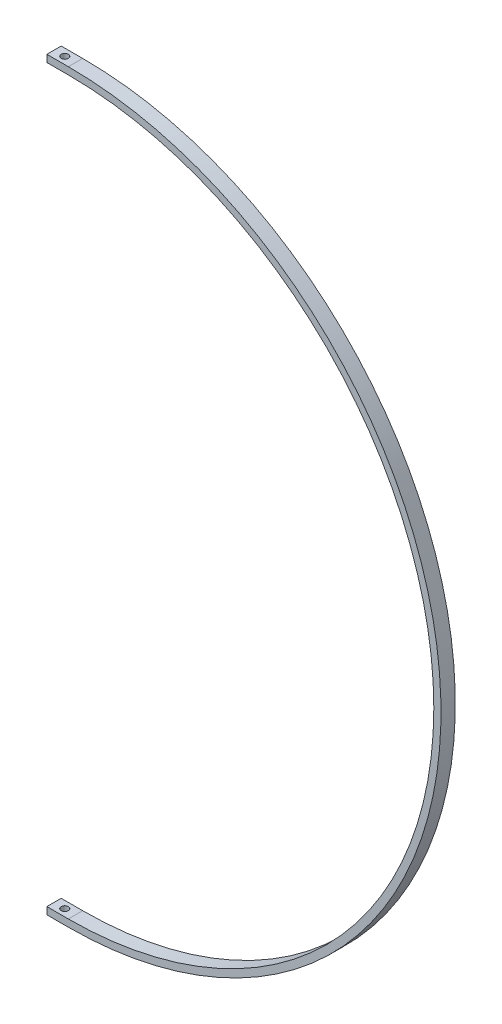
ISO-10303-21;
HEADER;
FILE_DESCRIPTION(('STEP AP214'),'2;1');
FILE_NAME('part.step','',(''),(''),'','','');
FILE_SCHEMA(('AUTOMOTIVE_DESIGN { 1 0 10303 214 1 1 1 1 }'));
ENDSEC;
DATA;
#1=APPLICATION_CONTEXT('core data for automotive mechanical design processes');
#2=APPLICATION_PROTOCOL_DEFINITION('international standard','automotive_design',2000,#1);
#3=PRODUCT_CONTEXT('',#1,'mechanical');
#4=PRODUCT('Part','Part','',(#3));
#5=PRODUCT_RELATED_PRODUCT_CATEGORY('part','',(#4));
#6=PRODUCT_DEFINITION_FORMATION('','',#4);
#7=PRODUCT_DEFINITION_CONTEXT('part definition',#1,'design');
#8=PRODUCT_DEFINITION('design','',#6,#7);
#9=PRODUCT_DEFINITION_SHAPE('','',#8);
#10=(LENGTH_UNIT() NAMED_UNIT(*) SI_UNIT(.MILLI.,.METRE.));
#11=(NAMED_UNIT(*) PLANE_ANGLE_UNIT() SI_UNIT($,.RADIAN.));
#12=(NAMED_UNIT(*) SI_UNIT($,.STERADIAN.) SOLID_ANGLE_UNIT());
#13=UNCERTAINTY_MEASURE_WITH_UNIT(LENGTH_MEASURE(1.E-05),#10,'distance_accuracy_value','');
#14=(GEOMETRIC_REPRESENTATION_CONTEXT(3) GLOBAL_UNCERTAINTY_ASSIGNED_CONTEXT((#13)) GLOBAL_UNIT_ASSIGNED_CONTEXT((#10,
#11,#12)) REPRESENTATION_CONTEXT('',''));
#15=CARTESIAN_POINT('',(0.,0.,0.));
#16=DIRECTION('',(0.,0.,1.));
#17=DIRECTION('',(1.,0.,0.));
#18=AXIS2_PLACEMENT_3D('',#15,#16,#17);
#19=CARTESIAN_POINT('',(-19.05,323.85,6.35000000000169));
#20=DIRECTION('',(0.,-1.,0.));
#21=DIRECTION('',(0.,0.,-1.));
#22=AXIS2_PLACEMENT_3D('',#19,#20,#21);
#23=PLANE('',#22);
#24=CARTESIAN_POINT('',(-9.525,323.85,0.));
#25=DIRECTION('',(0.,-1.,0.));
#26=DIRECTION('',(0.,0.,-1.));
#27=AXIS2_PLACEMENT_3D('',#24,#25,#26);
#28=CIRCLE('',#27,3.175);
#29=CARTESIAN_POINT('',(-9.525,323.85,3.175));
#30=VERTEX_POINT('',#29);
#31=EDGE_CURVE('E158',#30,#30,#28,.T.);
#32=ORIENTED_EDGE('',*,*,#31,.F.);
#33=EDGE_LOOP('',(#32));
#34=FACE_BOUND('',#33,.T.);
#35=DIRECTION('',(0.,0.,-1.));
#36=VECTOR('',#35,1.);
#37=CARTESIAN_POINT('',(0.,323.85,6.35000000000169));
#38=LINE('',#37,#36);
#39=CARTESIAN_POINT('',(0.,323.85,6.35000000000169));
#40=VERTEX_POINT('',#39);
#41=CARTESIAN_POINT('',(0.,323.85,-6.34999999999831));
#42=VERTEX_POINT('',#41);
#43=EDGE_CURVE('E161',#40,#42,#38,.T.);
#44=ORIENTED_EDGE('',*,*,#43,.F.);
#45=DIRECTION('',(1.,0.,0.));
#46=VECTOR('',#45,1.);
#47=CARTESIAN_POINT('',(-19.05,323.85,6.35000000000169));
#48=LINE('',#47,#46);
#49=CARTESIAN_POINT('',(-19.05,323.85,6.35000000000169));
#50=VERTEX_POINT('',#49);
#51=EDGE_CURVE('E11',#50,#40,#48,.T.);
#52=ORIENTED_EDGE('',*,*,#51,.F.);
#53=DIRECTION('',(0.,0.,-1.));
#54=VECTOR('',#53,1.);
#55=CARTESIAN_POINT('',(-19.05,323.85,6.35000000000169));
#56=LINE('',#55,#54);
#57=CARTESIAN_POINT('',(-19.05,323.85,-6.34999999999831));
#58=VERTEX_POINT('',#57);
#59=EDGE_CURVE('E162',#50,#58,#56,.T.);
#60=ORIENTED_EDGE('',*,*,#59,.T.);
#61=DIRECTION('',(1.,0.,0.));
#62=VECTOR('',#61,1.);
#63=CARTESIAN_POINT('',(-19.05,323.85,-6.34999999999831));
#64=LINE('',#63,#62);
#65=EDGE_CURVE('E37',#58,#42,#64,.T.);
#66=ORIENTED_EDGE('',*,*,#65,.T.);
#67=EDGE_LOOP('',(#44,#52,#60,#66));
#68=FACE_BOUND('',#67,.T.);
#69=ADVANCED_FACE('F34',(#34,#68),#23,.T.);
#70=CARTESIAN_POINT('',(-19.05,330.2,6.35000000000169));
#71=DIRECTION('',(0.,0.,1.));
#72=DIRECTION('',(1.,0.,0.));
#73=AXIS2_PLACEMENT_3D('',#70,#71,#72);
#74=PLANE('',#73);
#75=ORIENTED_EDGE('',*,*,#51,.T.);
#76=CARTESIAN_POINT('',(0.,0.,6.35000000000169));
#77=DIRECTION('',(0.,0.,1.));
#78=DIRECTION('',(1.,0.,0.));
#79=AXIS2_PLACEMENT_3D('',#76,#77,#78);
#80=CIRCLE('',#79,323.85);
#81=CARTESIAN_POINT('',(0.,-323.85,6.35000000000169));
#82=VERTEX_POINT('',#81);
#83=EDGE_CURVE('E106',#82,#40,#80,.T.);
#84=ORIENTED_EDGE('',*,*,#83,.F.);
#85=DIRECTION('',(1.,0.,0.));
#86=VECTOR('',#85,1.);
#87=CARTESIAN_POINT('',(-19.05,-323.85,6.35000000000169));
#88=LINE('',#87,#86);
#89=CARTESIAN_POINT('',(-19.05,-323.85,6.35000000000169));
#90=VERTEX_POINT('',#89);
#91=EDGE_CURVE('E110',#90,#82,#88,.T.);
#92=ORIENTED_EDGE('',*,*,#91,.F.);
#93=DIRECTION('',(0.,1.,0.));
#94=VECTOR('',#93,1.);
#95=CARTESIAN_POINT('',(-19.05,-330.2,6.35000000000169));
#96=LINE('',#95,#94);
#97=CARTESIAN_POINT('',(-19.05,-330.2,6.35000000000169));
#98=VERTEX_POINT('',#97);
#99=EDGE_CURVE('E139',#98,#90,#96,.T.);
#100=ORIENTED_EDGE('',*,*,#99,.F.);
#101=DIRECTION('',(1.,0.,0.));
#102=VECTOR('',#101,1.);
#103=CARTESIAN_POINT('',(-19.05,-330.2,6.35000000000169));
#104=LINE('',#103,#102);
#105=CARTESIAN_POINT('',(0.,-330.2,6.35000000000169));
#106=VERTEX_POINT('',#105);
#107=EDGE_CURVE('E125',#98,#106,#104,.T.);
#108=ORIENTED_EDGE('',*,*,#107,.T.);
#109=CARTESIAN_POINT('',(0.,0.,6.35000000000169));
#110=DIRECTION('',(0.,0.,1.));
#111=DIRECTION('',(1.,0.,0.));
#112=AXIS2_PLACEMENT_3D('',#109,#110,#111);
#113=CIRCLE('',#112,330.2);
#114=CARTESIAN_POINT('',(0.,330.2,6.35000000000169));
#115=VERTEX_POINT('',#114);
#116=EDGE_CURVE('E153',#106,#115,#113,.T.);
#117=ORIENTED_EDGE('',*,*,#116,.T.);
#118=DIRECTION('',(1.,0.,0.));
#119=VECTOR('',#118,1.);
#120=CARTESIAN_POINT('',(-19.05,330.2,6.35000000000169));
#121=LINE('',#120,#119);
#122=CARTESIAN_POINT('',(-19.05,330.2,6.35000000000169));
#123=VERTEX_POINT('',#122);
#124=EDGE_CURVE('E43',#123,#115,#121,.T.);
#125=ORIENTED_EDGE('',*,*,#124,.F.);
#126=DIRECTION('',(0.,-1.,0.));
#127=VECTOR('',#126,1.);
#128=CARTESIAN_POINT('',(-19.05,330.2,6.35000000000169));
#129=LINE('',#128,#127);
#130=EDGE_CURVE('E167',#123,#50,#129,.T.);
#131=ORIENTED_EDGE('',*,*,#130,.T.);
#132=EDGE_LOOP('',(#75,#84,#92,#100,#108,#117,#125,#131));
#133=FACE_BOUND('',#132,.T.);
#134=ADVANCED_FACE('F108',(#133),#74,.T.);
#135=CARTESIAN_POINT('',(-19.05,330.2,6.35000000000169));
#136=DIRECTION('',(0.,-1.,0.));
#137=DIRECTION('',(0.,0.,-1.));
#138=AXIS2_PLACEMENT_3D('',#135,#136,#137);
#139=PLANE('',#138);
#140=CARTESIAN_POINT('',(-9.525,330.2,0.));
#141=DIRECTION('',(0.,1.,0.));
#142=DIRECTION('',(0.,0.,1.));
#143=AXIS2_PLACEMENT_3D('',#140,#141,#142);
#144=CIRCLE('',#143,3.175);
#145=CARTESIAN_POINT('',(-9.525,330.2,3.175));
#146=VERTEX_POINT('',#145);
#147=EDGE_CURVE('E155',#146,#146,#144,.T.);
#148=ORIENTED_EDGE('',*,*,#147,.F.);
#149=EDGE_LOOP('',(#148));
#150=FACE_BOUND('',#149,.T.);
#151=DIRECTION('',(0.,0.,-1.));
#152=VECTOR('',#151,1.);
#153=CARTESIAN_POINT('',(0.,330.2,6.35000000000169));
#154=LINE('',#153,#152);
#155=CARTESIAN_POINT('',(0.,330.2,-6.34999999999831));
#156=VERTEX_POINT('',#155);
#157=EDGE_CURVE('E66',#115,#156,#154,.T.);
#158=ORIENTED_EDGE('',*,*,#157,.T.);
#159=DIRECTION('',(1.,0.,0.));
#160=VECTOR('',#159,1.);
#161=CARTESIAN_POINT('',(-19.05,330.2,-6.34999999999831));
#162=LINE('',#161,#160);
#163=CARTESIAN_POINT('',(-19.05,330.2,-6.34999999999831));
#164=VERTEX_POINT('',#163);
#165=EDGE_CURVE('E171',#164,#156,#162,.T.);
#166=ORIENTED_EDGE('',*,*,#165,.F.);
#167=DIRECTION('',(0.,0.,-1.));
#168=VECTOR('',#167,1.);
#169=CARTESIAN_POINT('',(-19.05,330.2,6.35000000000169));
#170=LINE('',#169,#168);
#171=EDGE_CURVE('E165',#123,#164,#170,.T.);
#172=ORIENTED_EDGE('',*,*,#171,.F.);
#173=ORIENTED_EDGE('',*,*,#124,.T.);
#174=EDGE_LOOP('',(#158,#166,#172,#173));
#175=FACE_BOUND('',#174,.T.);
#176=ADVANCED_FACE('F205',(#150,#175),#139,.F.);
#177=CARTESIAN_POINT('',(-19.05,330.2,-6.34999999999831));
#178=DIRECTION('',(0.,0.,1.));
#179=DIRECTION('',(1.,0.,0.));
#180=AXIS2_PLACEMENT_3D('',#177,#178,#179);
#181=PLANE('',#180);
#182=ORIENTED_EDGE('',*,*,#165,.T.);
#183=CARTESIAN_POINT('',(0.,0.,-6.3499999999983));
#184=DIRECTION('',(0.,0.,1.));
#185=DIRECTION('',(1.,0.,0.));
#186=AXIS2_PLACEMENT_3D('',#183,#184,#185);
#187=CIRCLE('',#186,330.2);
#188=CARTESIAN_POINT('',(0.,-330.2,-6.34999999999831));
#189=VERTEX_POINT('',#188);
#190=EDGE_CURVE('E150',#189,#156,#187,.T.);
#191=ORIENTED_EDGE('',*,*,#190,.F.);
#192=DIRECTION('',(1.,0.,0.));
#193=VECTOR('',#192,1.);
#194=CARTESIAN_POINT('',(-19.05,-330.2,-6.34999999999831));
#195=LINE('',#194,#193);
#196=CARTESIAN_POINT('',(-19.05,-330.2,-6.34999999999831));
#197=VERTEX_POINT('',#196);
#198=EDGE_CURVE('E144',#197,#189,#195,.T.);
#199=ORIENTED_EDGE('',*,*,#198,.F.);
#200=DIRECTION('',(0.,1.,0.));
#201=VECTOR('',#200,1.);
#202=CARTESIAN_POINT('',(-19.05,-330.2,-6.34999999999831));
#203=LINE('',#202,#201);
#204=CARTESIAN_POINT('',(-19.05,-323.85,-6.34999999999831));
#205=VERTEX_POINT('',#204);
#206=EDGE_CURVE('E175',#197,#205,#203,.T.);
#207=ORIENTED_EDGE('',*,*,#206,.T.);
#208=DIRECTION('',(1.,0.,0.));
#209=VECTOR('',#208,1.);
#210=CARTESIAN_POINT('',(-19.05,-323.85,-6.34999999999831));
#211=LINE('',#210,#209);
#212=CARTESIAN_POINT('',(0.,-323.85,-6.34999999999831));
#213=VERTEX_POINT('',#212);
#214=EDGE_CURVE('E147',#205,#213,#211,.T.);
#215=ORIENTED_EDGE('',*,*,#214,.T.);
#216=CARTESIAN_POINT('',(0.,0.,-6.3499999999983));
#217=DIRECTION('',(0.,0.,1.));
#218=DIRECTION('',(1.,0.,0.));
#219=AXIS2_PLACEMENT_3D('',#216,#217,#218);
#220=CIRCLE('',#219,323.85);
#221=EDGE_CURVE('E116',#213,#42,#220,.T.);
#222=ORIENTED_EDGE('',*,*,#221,.T.);
#223=ORIENTED_EDGE('',*,*,#65,.F.);
#224=DIRECTION('',(0.,-1.,0.));
#225=VECTOR('',#224,1.);
#226=CARTESIAN_POINT('',(-19.05,330.2,-6.34999999999831));
#227=LINE('',#226,#225);
#228=EDGE_CURVE('E76',#164,#58,#227,.T.);
#229=ORIENTED_EDGE('',*,*,#228,.F.);
#230=EDGE_LOOP('',(#182,#191,#199,#207,#215,#222,#223,#229));
#231=FACE_BOUND('',#230,.T.);
#232=ADVANCED_FACE('F173',(#231),#181,.F.);
#233=CARTESIAN_POINT('',(-19.05,0.,0.));
#234=DIRECTION('',(-1.,0.,0.));
#235=DIRECTION('',(0.,0.,1.));
#236=AXIS2_PLACEMENT_3D('',#233,#234,#235);
#237=PLANE('',#236);
#238=ORIENTED_EDGE('',*,*,#59,.F.);
#239=ORIENTED_EDGE('',*,*,#130,.F.);
#240=ORIENTED_EDGE('',*,*,#171,.T.);
#241=ORIENTED_EDGE('',*,*,#228,.T.);
#242=EDGE_LOOP('',(#238,#239,#240,#241));
#243=FACE_BOUND('',#242,.T.);
#244=ADVANCED_FACE('F197',(#243),#237,.T.);
#245=CARTESIAN_POINT('',(-9.525,311.15,0.));
#246=DIRECTION('',(0.,1.,0.));
#247=DIRECTION('',(0.,0.,1.));
#248=AXIS2_PLACEMENT_3D('',#245,#246,#247);
#249=CYLINDRICAL_SURFACE('',#248,3.175);
#250=CARTESIAN_POINT('',(-9.525,323.85,3.175));
#251=CARTESIAN_POINT('',(-9.525,323.916145833333,3.175));
#252=CARTESIAN_POINT('',(-9.525,323.982291666667,3.175));
#253=CARTESIAN_POINT('',(-9.525,324.114583333333,3.175));
#254=CARTESIAN_POINT('',(-9.525,324.180729166667,3.175));
#255=CARTESIAN_POINT('',(-9.525,324.313020833333,3.175));
#256=CARTESIAN_POINT('',(-9.525,324.379166666667,3.175));
#257=CARTESIAN_POINT('',(-9.525,324.511458333333,3.175));
#258=CARTESIAN_POINT('',(-9.525,324.577604166667,3.175));
#259=CARTESIAN_POINT('',(-9.525,324.709895833333,3.175));
#260=CARTESIAN_POINT('',(-9.525,324.776041666667,3.175));
#261=CARTESIAN_POINT('',(-9.525,324.908333333333,3.175));
#262=CARTESIAN_POINT('',(-9.525,324.974479166667,3.175));
#263=CARTESIAN_POINT('',(-9.525,325.106770833333,3.175));
#264=CARTESIAN_POINT('',(-9.525,325.172916666667,3.175));
#265=CARTESIAN_POINT('',(-9.525,325.305208333333,3.175));
#266=CARTESIAN_POINT('',(-9.525,325.371354166667,3.175));
#267=CARTESIAN_POINT('',(-9.525,325.503645833333,3.175));
#268=CARTESIAN_POINT('',(-9.525,325.569791666667,3.175));
#269=CARTESIAN_POINT('',(-9.525,325.702083333333,3.175));
#270=CARTESIAN_POINT('',(-9.525,325.768229166667,3.175));
#271=CARTESIAN_POINT('',(-9.525,325.900520833333,3.175));
#272=CARTESIAN_POINT('',(-9.525,325.966666666667,3.175));
#273=CARTESIAN_POINT('',(-9.525,326.098958333333,3.175));
#274=CARTESIAN_POINT('',(-9.525,326.165104166667,3.175));
#275=CARTESIAN_POINT('',(-9.525,326.297395833333,3.175));
#276=CARTESIAN_POINT('',(-9.525,326.363541666667,3.175));
#277=CARTESIAN_POINT('',(-9.525,326.495833333333,3.175));
#278=CARTESIAN_POINT('',(-9.525,326.561979166667,3.175));
#279=CARTESIAN_POINT('',(-9.525,326.694270833333,3.175));
#280=CARTESIAN_POINT('',(-9.525,326.760416666667,3.175));
#281=CARTESIAN_POINT('',(-9.525,326.892708333333,3.175));
#282=CARTESIAN_POINT('',(-9.525,326.958854166667,3.175));
#283=CARTESIAN_POINT('',(-9.525,327.091145833333,3.175));
#284=CARTESIAN_POINT('',(-9.525,327.157291666667,3.175));
#285=CARTESIAN_POINT('',(-9.525,327.289583333333,3.175));
#286=CARTESIAN_POINT('',(-9.525,327.355729166667,3.175));
#287=CARTESIAN_POINT('',(-9.525,327.488020833333,3.175));
#288=CARTESIAN_POINT('',(-9.525,327.554166666667,3.175));
#289=CARTESIAN_POINT('',(-9.525,327.686458333333,3.175));
#290=CARTESIAN_POINT('',(-9.525,327.752604166667,3.175));
#291=CARTESIAN_POINT('',(-9.525,327.884895833333,3.175));
#292=CARTESIAN_POINT('',(-9.525,327.951041666667,3.175));
#293=CARTESIAN_POINT('',(-9.525,328.083333333333,3.175));
#294=CARTESIAN_POINT('',(-9.525,328.149479166667,3.175));
#295=CARTESIAN_POINT('',(-9.525,328.281770833333,3.175));
#296=CARTESIAN_POINT('',(-9.525,328.347916666667,3.175));
#297=CARTESIAN_POINT('',(-9.525,328.480208333333,3.175));
#298=CARTESIAN_POINT('',(-9.525,328.546354166667,3.175));
#299=CARTESIAN_POINT('',(-9.525,328.678645833333,3.175));
#300=CARTESIAN_POINT('',(-9.525,328.744791666667,3.175));
#301=CARTESIAN_POINT('',(-9.525,328.877083333333,3.175));
#302=CARTESIAN_POINT('',(-9.525,328.943229166667,3.175));
#303=CARTESIAN_POINT('',(-9.525,329.075520833333,3.175));
#304=CARTESIAN_POINT('',(-9.525,329.141666666667,3.175));
#305=CARTESIAN_POINT('',(-9.525,329.273958333333,3.175));
#306=CARTESIAN_POINT('',(-9.525,329.340104166667,3.175));
#307=CARTESIAN_POINT('',(-9.525,329.472395833333,3.175));
#308=CARTESIAN_POINT('',(-9.525,329.538541666667,3.175));
#309=CARTESIAN_POINT('',(-9.525,329.670833333333,3.175));
#310=CARTESIAN_POINT('',(-9.525,329.736979166667,3.175));
#311=CARTESIAN_POINT('',(-9.525,329.869270833333,3.175));
#312=CARTESIAN_POINT('',(-9.525,329.935416666667,3.175));
#313=CARTESIAN_POINT('',(-9.525,330.067708333333,3.175));
#314=CARTESIAN_POINT('',(-9.525,330.133854166667,3.175));
#315=CARTESIAN_POINT('',(-9.525,330.2,3.175));
#316=B_SPLINE_CURVE_WITH_KNOTS('',3,(#250,#251,#252,#253,#254,#255,#256,#257,#258,#259,#260,
#261,#262,#263,#264,#265,#266,#267,#268,#269,#270,#271,#272,#273,#274,#275,#276,#277,#278,#279,
#280,#281,#282,#283,#284,#285,#286,#287,#288,#289,#290,#291,#292,#293,#294,#295,#296,#297,#298,
#299,#300,#301,#302,#303,#304,#305,#306,#307,#308,#309,#310,#311,#312,#313,#314,#315),
.UNSPECIFIED.,.F.,.F.,(4,2,2,2,2,2,2,2,2,2,2,2,2,2,2,2,2,2,2,2,2,2,2,2,2,2,2,2,2,2,2,2,4),(0.,
0.198437500000037,0.396875000000019,0.5953125,0.793750000000037,0.992187500000019,1.190625,
1.38906250000004,1.58750000000002,1.7859375,1.98437500000004,2.18281250000002,2.38125,
2.57968750000004,2.77812500000002,2.9765625,3.17499999999998,3.37343750000002,3.571875,
3.77031249999998,3.96875000000002,4.1671875,4.36562499999998,4.56406250000002,4.7625,
4.96093749999998,5.15937500000002,5.3578125,5.55624999999998,5.75468750000002,5.953125,
6.15156249999998,6.34999999999997),.UNSPECIFIED.);
#317=EDGE_CURVE('BSEAM190',#30,#146,#316,.T.);
#318=ORIENTED_EDGE('',*,*,#31,.T.);
#319=ORIENTED_EDGE('',*,*,#147,.T.);
#320=ORIENTED_EDGE('',*,*,#317,.T.);
#321=ORIENTED_EDGE('',*,*,#317,.F.);
#322=EDGE_LOOP('',(#318,#320,#319,#321));
#323=FACE_BOUND('',#322,.T.);
#324=ADVANCED_FACE('F190',(#323),#249,.F.);
#325=CARTESIAN_POINT('',(0.,0.,-195.314118549859));
#326=DIRECTION('',(0.,0.,1.));
#327=DIRECTION('',(1.,0.,0.));
#328=AXIS2_PLACEMENT_3D('',#325,#326,#327);
#329=CYLINDRICAL_SURFACE('',#328,330.2);
#330=ORIENTED_EDGE('',*,*,#190,.T.);
#331=ORIENTED_EDGE('',*,*,#157,.F.);
#332=ORIENTED_EDGE('',*,*,#116,.F.);
#333=DIRECTION('',(0.,0.,-1.));
#334=VECTOR('',#333,1.);
#335=CARTESIAN_POINT('',(0.,-330.2,6.35000000000169));
#336=LINE('',#335,#334);
#337=EDGE_CURVE('E130',#106,#189,#336,.T.);
#338=ORIENTED_EDGE('',*,*,#337,.T.);
#339=EDGE_LOOP('',(#330,#331,#332,#338));
#340=FACE_BOUND('',#339,.T.);
#341=ADVANCED_FACE('F188',(#340),#329,.T.);
#342=CARTESIAN_POINT('',(0.,0.,-195.314118549859));
#343=DIRECTION('',(0.,0.,1.));
#344=DIRECTION('',(1.,0.,0.));
#345=AXIS2_PLACEMENT_3D('',#342,#343,#344);
#346=CYLINDRICAL_SURFACE('',#345,323.85);
#347=ORIENTED_EDGE('',*,*,#221,.F.);
#348=DIRECTION('',(0.,0.,-1.));
#349=VECTOR('',#348,1.);
#350=CARTESIAN_POINT('',(0.,-323.85,6.35000000000169));
#351=LINE('',#350,#349);
#352=EDGE_CURVE('E122',#82,#213,#351,.T.);
#353=ORIENTED_EDGE('',*,*,#352,.F.);
#354=ORIENTED_EDGE('',*,*,#83,.T.);
#355=ORIENTED_EDGE('',*,*,#43,.T.);
#356=EDGE_LOOP('',(#347,#353,#354,#355));
#357=FACE_BOUND('',#356,.T.);
#358=ADVANCED_FACE('F127',(#357),#346,.F.);
#359=CARTESIAN_POINT('',(-19.05,-323.85,6.35000000000169));
#360=DIRECTION('',(0.,1.,0.));
#361=DIRECTION('',(0.,0.,-1.));
#362=AXIS2_PLACEMENT_3D('',#359,#360,#361);
#363=PLANE('',#362);
#364=CARTESIAN_POINT('',(-9.525,-323.85,0.));
#365=DIRECTION('',(0.,-1.,0.));
#366=DIRECTION('',(0.,0.,-1.));
#367=AXIS2_PLACEMENT_3D('',#364,#365,#366);
#368=CIRCLE('',#367,3.175);
#369=CARTESIAN_POINT('',(-9.525,-323.85,3.175));
#370=VERTEX_POINT('',#369);
#371=EDGE_CURVE('E131',#370,#370,#368,.T.);
#372=ORIENTED_EDGE('',*,*,#371,.T.);
#373=EDGE_LOOP('',(#372));
#374=FACE_BOUND('',#373,.T.);
#375=ORIENTED_EDGE('',*,*,#352,.T.);
#376=ORIENTED_EDGE('',*,*,#214,.F.);
#377=DIRECTION('',(0.,0.,-1.));
#378=VECTOR('',#377,1.);
#379=CARTESIAN_POINT('',(-19.05,-323.85,6.35000000000169));
#380=LINE('',#379,#378);
#381=EDGE_CURVE('E124',#90,#205,#380,.T.);
#382=ORIENTED_EDGE('',*,*,#381,.F.);
#383=ORIENTED_EDGE('',*,*,#91,.T.);
#384=EDGE_LOOP('',(#375,#376,#382,#383));
#385=FACE_BOUND('',#384,.T.);
#386=ADVANCED_FACE('F120',(#374,#385),#363,.T.);
#387=CARTESIAN_POINT('',(-19.05,-330.2,6.35000000000169));
#388=DIRECTION('',(0.,1.,0.));
#389=DIRECTION('',(0.,0.,-1.));
#390=AXIS2_PLACEMENT_3D('',#387,#388,#389);
#391=PLANE('',#390);
#392=CARTESIAN_POINT('',(-9.525,-330.2,0.));
#393=DIRECTION('',(0.,1.,0.));
#394=DIRECTION('',(0.,0.,1.));
#395=AXIS2_PLACEMENT_3D('',#392,#393,#394);
#396=CIRCLE('',#395,3.175);
#397=CARTESIAN_POINT('',(-9.525,-330.2,3.175));
#398=VERTEX_POINT('',#397);
#399=EDGE_CURVE('E136',#398,#398,#396,.T.);
#400=ORIENTED_EDGE('',*,*,#399,.T.);
#401=EDGE_LOOP('',(#400));
#402=FACE_BOUND('',#401,.T.);
#403=ORIENTED_EDGE('',*,*,#337,.F.);
#404=ORIENTED_EDGE('',*,*,#107,.F.);
#405=DIRECTION('',(0.,0.,-1.));
#406=VECTOR('',#405,1.);
#407=CARTESIAN_POINT('',(-19.05,-330.2,6.35000000000169));
#408=LINE('',#407,#406);
#409=EDGE_CURVE('E178',#98,#197,#408,.T.);
#410=ORIENTED_EDGE('',*,*,#409,.T.);
#411=ORIENTED_EDGE('',*,*,#198,.T.);
#412=EDGE_LOOP('',(#403,#404,#410,#411));
#413=FACE_BOUND('',#412,.T.);
#414=ADVANCED_FACE('F186',(#402,#413),#391,.F.);
#415=CARTESIAN_POINT('',(-19.05,0.,0.));
#416=DIRECTION('',(-1.,0.,0.));
#417=DIRECTION('',(0.,0.,1.));
#418=AXIS2_PLACEMENT_3D('',#415,#416,#417);
#419=PLANE('',#418);
#420=ORIENTED_EDGE('',*,*,#381,.T.);
#421=ORIENTED_EDGE('',*,*,#206,.F.);
#422=ORIENTED_EDGE('',*,*,#409,.F.);
#423=ORIENTED_EDGE('',*,*,#99,.T.);
#424=EDGE_LOOP('',(#420,#421,#422,#423));
#425=FACE_BOUND('',#424,.T.);
#426=ADVANCED_FACE('F180',(#425),#419,.T.);
#427=CARTESIAN_POINT('',(-9.525,-311.15,0.));
#428=DIRECTION('',(0.,-1.,0.));
#429=DIRECTION('',(0.,0.,1.));
#430=AXIS2_PLACEMENT_3D('',#427,#428,#429);
#431=CYLINDRICAL_SURFACE('',#430,3.175);
#432=CARTESIAN_POINT('',(-9.525,-323.85,3.175));
#433=CARTESIAN_POINT('',(-9.525,-323.916145833333,3.175));
#434=CARTESIAN_POINT('',(-9.525,-323.982291666667,3.175));
#435=CARTESIAN_POINT('',(-9.525,-324.114583333333,3.175));
#436=CARTESIAN_POINT('',(-9.525,-324.180729166667,3.175));
#437=CARTESIAN_POINT('',(-9.525,-324.313020833333,3.175));
#438=CARTESIAN_POINT('',(-9.525,-324.379166666667,3.175));
#439=CARTESIAN_POINT('',(-9.525,-324.511458333333,3.175));
#440=CARTESIAN_POINT('',(-9.525,-324.577604166667,3.175));
#441=CARTESIAN_POINT('',(-9.525,-324.709895833333,3.175));
#442=CARTESIAN_POINT('',(-9.525,-324.776041666667,3.175));
#443=CARTESIAN_POINT('',(-9.525,-324.908333333333,3.175));
#444=CARTESIAN_POINT('',(-9.525,-324.974479166667,3.175));
#445=CARTESIAN_POINT('',(-9.525,-325.106770833333,3.175));
#446=CARTESIAN_POINT('',(-9.525,-325.172916666667,3.175));
#447=CARTESIAN_POINT('',(-9.525,-325.305208333333,3.175));
#448=CARTESIAN_POINT('',(-9.525,-325.371354166667,3.175));
#449=CARTESIAN_POINT('',(-9.525,-325.503645833333,3.175));
#450=CARTESIAN_POINT('',(-9.525,-325.569791666667,3.175));
#451=CARTESIAN_POINT('',(-9.525,-325.702083333333,3.175));
#452=CARTESIAN_POINT('',(-9.525,-325.768229166667,3.175));
#453=CARTESIAN_POINT('',(-9.525,-325.900520833333,3.175));
#454=CARTESIAN_POINT('',(-9.525,-325.966666666667,3.175));
#455=CARTESIAN_POINT('',(-9.525,-326.098958333333,3.175));
#456=CARTESIAN_POINT('',(-9.525,-326.165104166667,3.175));
#457=CARTESIAN_POINT('',(-9.525,-326.297395833333,3.175));
#458=CARTESIAN_POINT('',(-9.525,-326.363541666667,3.175));
#459=CARTESIAN_POINT('',(-9.525,-326.495833333333,3.175));
#460=CARTESIAN_POINT('',(-9.525,-326.561979166667,3.175));
#461=CARTESIAN_POINT('',(-9.525,-326.694270833333,3.175));
#462=CARTESIAN_POINT('',(-9.525,-326.760416666667,3.175));
#463=CARTESIAN_POINT('',(-9.525,-326.892708333333,3.175));
#464=CARTESIAN_POINT('',(-9.525,-326.958854166667,3.175));
#465=CARTESIAN_POINT('',(-9.525,-327.091145833333,3.175));
#466=CARTESIAN_POINT('',(-9.525,-327.157291666667,3.175));
#467=CARTESIAN_POINT('',(-9.525,-327.289583333333,3.175));
#468=CARTESIAN_POINT('',(-9.525,-327.355729166667,3.175));
#469=CARTESIAN_POINT('',(-9.525,-327.488020833333,3.175));
#470=CARTESIAN_POINT('',(-9.525,-327.554166666667,3.175));
#471=CARTESIAN_POINT('',(-9.525,-327.686458333333,3.175));
#472=CARTESIAN_POINT('',(-9.525,-327.752604166667,3.175));
#473=CARTESIAN_POINT('',(-9.525,-327.884895833333,3.175));
#474=CARTESIAN_POINT('',(-9.525,-327.951041666667,3.175));
#475=CARTESIAN_POINT('',(-9.525,-328.083333333333,3.175));
#476=CARTESIAN_POINT('',(-9.525,-328.149479166667,3.175));
#477=CARTESIAN_POINT('',(-9.525,-328.281770833333,3.175));
#478=CARTESIAN_POINT('',(-9.525,-328.347916666667,3.175));
#479=CARTESIAN_POINT('',(-9.525,-328.480208333333,3.175));
#480=CARTESIAN_POINT('',(-9.525,-328.546354166667,3.175));
#481=CARTESIAN_POINT('',(-9.525,-328.678645833333,3.175));
#482=CARTESIAN_POINT('',(-9.525,-328.744791666667,3.175));
#483=CARTESIAN_POINT('',(-9.525,-328.877083333333,3.175));
#484=CARTESIAN_POINT('',(-9.525,-328.943229166667,3.175));
#485=CARTESIAN_POINT('',(-9.525,-329.075520833333,3.175));
#486=CARTESIAN_POINT('',(-9.525,-329.141666666667,3.175));
#487=CARTESIAN_POINT('',(-9.525,-329.273958333333,3.175));
#488=CARTESIAN_POINT('',(-9.525,-329.340104166667,3.175));
#489=CARTESIAN_POINT('',(-9.525,-329.472395833333,3.175));
#490=CARTESIAN_POINT('',(-9.525,-329.538541666667,3.175));
#491=CARTESIAN_POINT('',(-9.525,-329.670833333333,3.175));
#492=CARTESIAN_POINT('',(-9.525,-329.736979166667,3.175));
#493=CARTESIAN_POINT('',(-9.525,-329.869270833333,3.175));
#494=CARTESIAN_POINT('',(-9.525,-329.935416666667,3.175));
#495=CARTESIAN_POINT('',(-9.525,-330.067708333333,3.175));
#496=CARTESIAN_POINT('',(-9.525,-330.133854166667,3.175));
#497=CARTESIAN_POINT('',(-9.525,-330.2,3.175));
#498=B_SPLINE_CURVE_WITH_KNOTS('',3,(#432,#433,#434,#435,#436,#437,#438,#439,#440,#441,#442,
#443,#444,#445,#446,#447,#448,#449,#450,#451,#452,#453,#454,#455,#456,#457,#458,#459,#460,#461,
#462,#463,#464,#465,#466,#467,#468,#469,#470,#471,#472,#473,#474,#475,#476,#477,#478,#479,#480,
#481,#482,#483,#484,#485,#486,#487,#488,#489,#490,#491,#492,#493,#494,#495,#496,#497),
.UNSPECIFIED.,.F.,.F.,(4,2,2,2,2,2,2,2,2,2,2,2,2,2,2,2,2,2,2,2,2,2,2,2,2,2,2,2,2,2,2,2,4),(0.,
0.198437500000037,0.396875000000019,0.595312500000056,0.793750000000037,0.992187500000019,
1.19062500000006,1.38906250000004,1.58750000000002,1.78593750000006,1.98437500000004,
2.18281250000002,2.38125000000006,2.57968750000004,2.77812500000002,2.97656250000006,
3.17500000000004,3.37343750000002,3.57187500000006,3.77031250000004,3.96875000000002,
4.16718750000006,4.36562500000004,4.56406250000002,4.76250000000006,4.96093750000004,
5.15937500000002,5.35781250000006,5.55625000000004,5.75468750000002,5.95312500000006,
6.15156250000004,6.35000000000008),.UNSPECIFIED.);
#499=EDGE_CURVE('BSEAM278',#370,#398,#498,.T.);
#500=ORIENTED_EDGE('',*,*,#371,.F.);
#501=ORIENTED_EDGE('',*,*,#399,.F.);
#502=ORIENTED_EDGE('',*,*,#499,.T.);
#503=ORIENTED_EDGE('',*,*,#499,.F.);
#504=EDGE_LOOP('',(#500,#502,#501,#503));
#505=FACE_BOUND('',#504,.T.);
#506=ADVANCED_FACE('F278',(#505),#431,.F.);
#507=CLOSED_SHELL('',(#69,#134,#176,#232,#244,#324,#341,#358,#386,#414,#426,#506));
#508=MANIFOLD_SOLID_BREP('B2',#507);
#509=ADVANCED_BREP_SHAPE_REPRESENTATION('',(#18,#508),#14);
#510=SHAPE_DEFINITION_REPRESENTATION(#9,#509);
ENDSEC;
END-ISO-10303-21;
